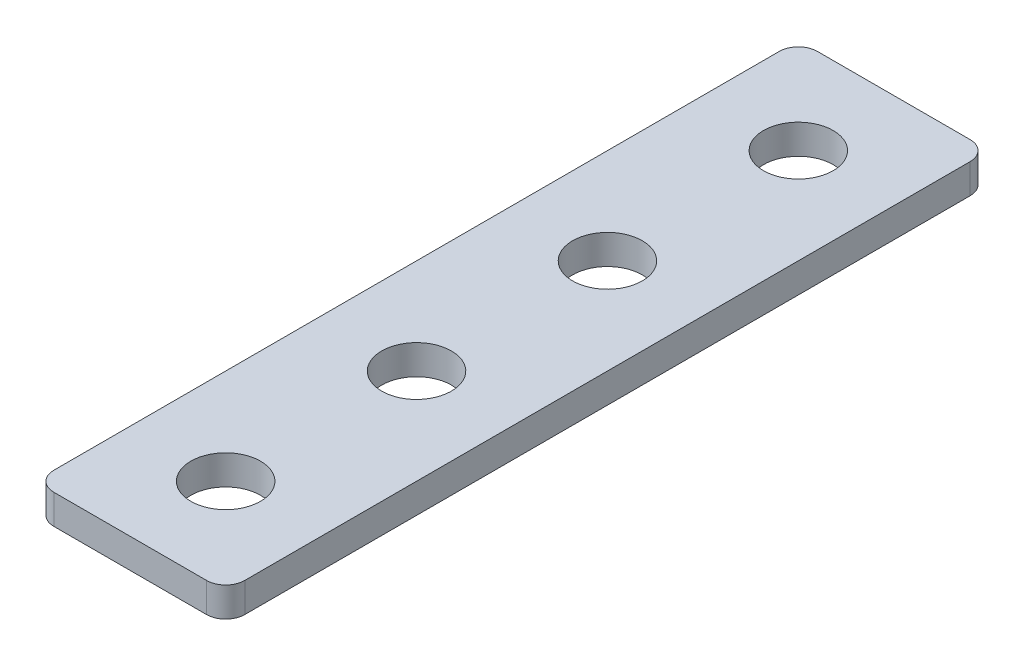
ISO-10303-21;
HEADER;
FILE_DESCRIPTION(('STEP AP214'),'2;1');
FILE_NAME('part.step','',(''),(''),'','','');
FILE_SCHEMA(('AUTOMOTIVE_DESIGN { 1 0 10303 214 1 1 1 1 }'));
ENDSEC;
DATA;
#1=APPLICATION_CONTEXT('core data for automotive mechanical design processes');
#2=APPLICATION_PROTOCOL_DEFINITION('international standard','automotive_design',2000,#1);
#3=PRODUCT_CONTEXT('',#1,'mechanical');
#4=PRODUCT('Part','Part','',(#3));
#5=PRODUCT_RELATED_PRODUCT_CATEGORY('part','',(#4));
#6=PRODUCT_DEFINITION_FORMATION('','',#4);
#7=PRODUCT_DEFINITION_CONTEXT('part definition',#1,'design');
#8=PRODUCT_DEFINITION('design','',#6,#7);
#9=PRODUCT_DEFINITION_SHAPE('','',#8);
#10=(LENGTH_UNIT() NAMED_UNIT(*) SI_UNIT(.MILLI.,.METRE.));
#11=(NAMED_UNIT(*) PLANE_ANGLE_UNIT() SI_UNIT($,.RADIAN.));
#12=(NAMED_UNIT(*) SI_UNIT($,.STERADIAN.) SOLID_ANGLE_UNIT());
#13=UNCERTAINTY_MEASURE_WITH_UNIT(LENGTH_MEASURE(1.E-05),#10,'distance_accuracy_value','');
#14=(GEOMETRIC_REPRESENTATION_CONTEXT(3) GLOBAL_UNCERTAINTY_ASSIGNED_CONTEXT((#13)) GLOBAL_UNIT_ASSIGNED_CONTEXT((#10,
#11,#12)) REPRESENTATION_CONTEXT('',''));
#15=CARTESIAN_POINT('',(0.,0.,0.));
#16=DIRECTION('',(0.,0.,1.));
#17=DIRECTION('',(1.,0.,0.));
#18=AXIS2_PLACEMENT_3D('',#15,#16,#17);
#19=CARTESIAN_POINT('',(0.,1.55,0.));
#20=DIRECTION('',(0.,1.,0.));
#21=DIRECTION('',(0.,0.,1.));
#22=AXIS2_PLACEMENT_3D('',#19,#20,#21);
#23=PLANE('',#22);
#24=CARTESIAN_POINT('',(0.,1.55,5.));
#25=DIRECTION('',(0.,1.,0.));
#26=DIRECTION('',(0.,0.,1.));
#27=AXIS2_PLACEMENT_3D('',#24,#25,#26);
#28=CIRCLE('',#27,1.825);
#29=CARTESIAN_POINT('',(0.,1.55,3.175));
#30=VERTEX_POINT('',#29);
#31=EDGE_CURVE('E195',#30,#30,#28,.T.);
#32=ORIENTED_EDGE('',*,*,#31,.F.);
#33=EDGE_LOOP('',(#32));
#34=FACE_BOUND('',#33,.T.);
#35=CARTESIAN_POINT('',(0.,1.55,-15.));
#36=DIRECTION('',(0.,1.,0.));
#37=DIRECTION('',(0.,0.,1.));
#38=AXIS2_PLACEMENT_3D('',#35,#36,#37);
#39=CIRCLE('',#38,1.825);
#40=CARTESIAN_POINT('',(0.,1.55,-16.825));
#41=VERTEX_POINT('',#40);
#42=EDGE_CURVE('E133',#41,#41,#39,.T.);
#43=ORIENTED_EDGE('',*,*,#42,.F.);
#44=EDGE_LOOP('',(#43));
#45=FACE_BOUND('',#44,.T.);
#46=DIRECTION('',(1.,0.,0.));
#47=VECTOR('',#46,1.);
#48=CARTESIAN_POINT('',(-5.,1.55,20.));
#49=LINE('',#48,#47);
#50=CARTESIAN_POINT('',(-4.,1.55,20.));
#51=VERTEX_POINT('',#50);
#52=CARTESIAN_POINT('',(4.,1.55,20.));
#53=VERTEX_POINT('',#52);
#54=EDGE_CURVE('E142',#51,#53,#49,.T.);
#55=ORIENTED_EDGE('',*,*,#54,.T.);
#56=CARTESIAN_POINT('',(4.,1.55,19.));
#57=DIRECTION('',(0.,1.,0.));
#58=DIRECTION('',(0.,0.,1.));
#59=AXIS2_PLACEMENT_3D('',#56,#57,#58);
#60=CIRCLE('',#59,1.);
#61=CARTESIAN_POINT('',(5.,1.55,19.));
#62=VERTEX_POINT('',#61);
#63=EDGE_CURVE('E160',#53,#62,#60,.T.);
#64=ORIENTED_EDGE('',*,*,#63,.T.);
#65=DIRECTION('',(0.,0.,-1.));
#66=VECTOR('',#65,1.);
#67=CARTESIAN_POINT('',(5.,1.55,-20.));
#68=LINE('',#67,#66);
#69=CARTESIAN_POINT('',(5.,1.55,-19.));
#70=VERTEX_POINT('',#69);
#71=EDGE_CURVE('E124',#62,#70,#68,.T.);
#72=ORIENTED_EDGE('',*,*,#71,.T.);
#73=CARTESIAN_POINT('',(4.,1.55,-19.));
#74=DIRECTION('',(0.,1.,0.));
#75=DIRECTION('',(0.,0.,1.));
#76=AXIS2_PLACEMENT_3D('',#73,#74,#75);
#77=CIRCLE('',#76,1.);
#78=CARTESIAN_POINT('',(4.,1.55,-20.));
#79=VERTEX_POINT('',#78);
#80=EDGE_CURVE('E156',#70,#79,#77,.T.);
#81=ORIENTED_EDGE('',*,*,#80,.T.);
#82=DIRECTION('',(-1.,0.,0.));
#83=VECTOR('',#82,1.);
#84=CARTESIAN_POINT('',(-5.,1.55,-20.));
#85=LINE('',#84,#83);
#86=CARTESIAN_POINT('',(-4.,1.55,-20.));
#87=VERTEX_POINT('',#86);
#88=EDGE_CURVE('E169',#79,#87,#85,.T.);
#89=ORIENTED_EDGE('',*,*,#88,.T.);
#90=CARTESIAN_POINT('',(-4.,1.55,-19.));
#91=DIRECTION('',(0.,1.,0.));
#92=DIRECTION('',(0.,0.,1.));
#93=AXIS2_PLACEMENT_3D('',#90,#91,#92);
#94=CIRCLE('',#93,1.);
#95=CARTESIAN_POINT('',(-5.,1.55,-19.));
#96=VERTEX_POINT('',#95);
#97=EDGE_CURVE('E59',#87,#96,#94,.T.);
#98=ORIENTED_EDGE('',*,*,#97,.T.);
#99=DIRECTION('',(0.,0.,1.));
#100=VECTOR('',#99,1.);
#101=CARTESIAN_POINT('',(-5.,1.55,-20.));
#102=LINE('',#101,#100);
#103=CARTESIAN_POINT('',(-5.,1.55,19.));
#104=VERTEX_POINT('',#103);
#105=EDGE_CURVE('E175',#96,#104,#102,.T.);
#106=ORIENTED_EDGE('',*,*,#105,.T.);
#107=CARTESIAN_POINT('',(-4.,1.55,19.));
#108=DIRECTION('',(0.,1.,0.));
#109=DIRECTION('',(0.,0.,1.));
#110=AXIS2_PLACEMENT_3D('',#107,#108,#109);
#111=CIRCLE('',#110,1.);
#112=EDGE_CURVE('E158',#104,#51,#111,.T.);
#113=ORIENTED_EDGE('',*,*,#112,.T.);
#114=EDGE_LOOP('',(#55,#64,#72,#81,#89,#98,#106,#113));
#115=FACE_BOUND('',#114,.T.);
#116=CARTESIAN_POINT('',(0.,1.55,-5.));
#117=DIRECTION('',(0.,1.,0.));
#118=DIRECTION('',(0.,0.,1.));
#119=AXIS2_PLACEMENT_3D('',#116,#117,#118);
#120=CIRCLE('',#119,1.825);
#121=CARTESIAN_POINT('',(0.,1.55,-6.825));
#122=VERTEX_POINT('',#121);
#123=EDGE_CURVE('E190',#122,#122,#120,.T.);
#124=ORIENTED_EDGE('',*,*,#123,.F.);
#125=EDGE_LOOP('',(#124));
#126=FACE_BOUND('',#125,.T.);
#127=CARTESIAN_POINT('',(0.,1.55,15.));
#128=DIRECTION('',(0.,1.,0.));
#129=DIRECTION('',(0.,0.,1.));
#130=AXIS2_PLACEMENT_3D('',#127,#128,#129);
#131=CIRCLE('',#130,1.825);
#132=CARTESIAN_POINT('',(0.,1.55,13.175));
#133=VERTEX_POINT('',#132);
#134=EDGE_CURVE('E201',#133,#133,#131,.T.);
#135=ORIENTED_EDGE('',*,*,#134,.F.);
#136=EDGE_LOOP('',(#135));
#137=FACE_BOUND('',#136,.T.);
#138=ADVANCED_FACE('F37',(#34,#45,#115,#126,#137),#23,.T.);
#139=CARTESIAN_POINT('',(0.,0.,0.));
#140=DIRECTION('',(0.,1.,0.));
#141=DIRECTION('',(0.,0.,1.));
#142=AXIS2_PLACEMENT_3D('',#139,#140,#141);
#143=PLANE('',#142);
#144=DIRECTION('',(0.,0.,-1.));
#145=VECTOR('',#144,1.);
#146=CARTESIAN_POINT('',(5.,0.,-20.));
#147=LINE('',#146,#145);
#148=CARTESIAN_POINT('',(5.,0.,19.));
#149=VERTEX_POINT('',#148);
#150=CARTESIAN_POINT('',(5.,0.,-19.));
#151=VERTEX_POINT('',#150);
#152=EDGE_CURVE('E121',#149,#151,#147,.T.);
#153=ORIENTED_EDGE('',*,*,#152,.F.);
#154=CARTESIAN_POINT('',(4.,0.,19.));
#155=DIRECTION('',(0.,1.,0.));
#156=DIRECTION('',(0.,0.,1.));
#157=AXIS2_PLACEMENT_3D('',#154,#155,#156);
#158=CIRCLE('',#157,1.);
#159=CARTESIAN_POINT('',(4.,0.,20.));
#160=VERTEX_POINT('',#159);
#161=EDGE_CURVE('E104',#149,#160,#158,.F.);
#162=ORIENTED_EDGE('',*,*,#161,.T.);
#163=DIRECTION('',(1.,0.,0.));
#164=VECTOR('',#163,1.);
#165=CARTESIAN_POINT('',(-5.,0.,20.));
#166=LINE('',#165,#164);
#167=CARTESIAN_POINT('',(-4.,0.,20.));
#168=VERTEX_POINT('',#167);
#169=EDGE_CURVE('E146',#168,#160,#166,.T.);
#170=ORIENTED_EDGE('',*,*,#169,.F.);
#171=CARTESIAN_POINT('',(-4.,0.,19.));
#172=DIRECTION('',(0.,1.,0.));
#173=DIRECTION('',(0.,0.,1.));
#174=AXIS2_PLACEMENT_3D('',#171,#172,#173);
#175=CIRCLE('',#174,1.);
#176=CARTESIAN_POINT('',(-5.,0.,19.));
#177=VERTEX_POINT('',#176);
#178=EDGE_CURVE('E115',#168,#177,#175,.F.);
#179=ORIENTED_EDGE('',*,*,#178,.T.);
#180=DIRECTION('',(0.,0.,1.));
#181=VECTOR('',#180,1.);
#182=CARTESIAN_POINT('',(-5.,0.,-20.));
#183=LINE('',#182,#181);
#184=CARTESIAN_POINT('',(-5.,0.,-19.));
#185=VERTEX_POINT('',#184);
#186=EDGE_CURVE('E136',#185,#177,#183,.T.);
#187=ORIENTED_EDGE('',*,*,#186,.F.);
#188=CARTESIAN_POINT('',(-4.,0.,-19.));
#189=DIRECTION('',(0.,1.,0.));
#190=DIRECTION('',(0.,0.,1.));
#191=AXIS2_PLACEMENT_3D('',#188,#189,#190);
#192=CIRCLE('',#191,1.);
#193=CARTESIAN_POINT('',(-4.,0.,-20.));
#194=VERTEX_POINT('',#193);
#195=EDGE_CURVE('E125',#185,#194,#192,.F.);
#196=ORIENTED_EDGE('',*,*,#195,.T.);
#197=DIRECTION('',(-1.,0.,0.));
#198=VECTOR('',#197,1.);
#199=CARTESIAN_POINT('',(-5.,0.,-20.));
#200=LINE('',#199,#198);
#201=CARTESIAN_POINT('',(4.,0.,-20.));
#202=VERTEX_POINT('',#201);
#203=EDGE_CURVE('E132',#202,#194,#200,.T.);
#204=ORIENTED_EDGE('',*,*,#203,.F.);
#205=CARTESIAN_POINT('',(4.,0.,-19.));
#206=DIRECTION('',(0.,1.,0.));
#207=DIRECTION('',(0.,0.,1.));
#208=AXIS2_PLACEMENT_3D('',#205,#206,#207);
#209=CIRCLE('',#208,1.);
#210=EDGE_CURVE('E131',#202,#151,#209,.F.);
#211=ORIENTED_EDGE('',*,*,#210,.T.);
#212=EDGE_LOOP('',(#153,#162,#170,#179,#187,#196,#204,#211));
#213=FACE_BOUND('',#212,.T.);
#214=CARTESIAN_POINT('',(0.,0.,-15.));
#215=DIRECTION('',(0.,1.,0.));
#216=DIRECTION('',(0.,0.,1.));
#217=AXIS2_PLACEMENT_3D('',#214,#215,#216);
#218=CIRCLE('',#217,1.825);
#219=CARTESIAN_POINT('',(0.,0.,-16.825));
#220=VERTEX_POINT('',#219);
#221=EDGE_CURVE('E139',#220,#220,#218,.T.);
#222=ORIENTED_EDGE('',*,*,#221,.T.);
#223=EDGE_LOOP('',(#222));
#224=FACE_BOUND('',#223,.T.);
#225=CARTESIAN_POINT('',(0.,0.,-5.));
#226=DIRECTION('',(0.,1.,0.));
#227=DIRECTION('',(0.,0.,1.));
#228=AXIS2_PLACEMENT_3D('',#225,#226,#227);
#229=CIRCLE('',#228,1.825);
#230=CARTESIAN_POINT('',(0.,0.,-6.825));
#231=VERTEX_POINT('',#230);
#232=EDGE_CURVE('E192',#231,#231,#229,.T.);
#233=ORIENTED_EDGE('',*,*,#232,.T.);
#234=EDGE_LOOP('',(#233));
#235=FACE_BOUND('',#234,.T.);
#236=CARTESIAN_POINT('',(0.,0.,5.));
#237=DIRECTION('',(0.,1.,0.));
#238=DIRECTION('',(0.,0.,1.));
#239=AXIS2_PLACEMENT_3D('',#236,#237,#238);
#240=CIRCLE('',#239,1.825);
#241=CARTESIAN_POINT('',(0.,0.,3.175));
#242=VERTEX_POINT('',#241);
#243=EDGE_CURVE('E198',#242,#242,#240,.T.);
#244=ORIENTED_EDGE('',*,*,#243,.T.);
#245=EDGE_LOOP('',(#244));
#246=FACE_BOUND('',#245,.T.);
#247=CARTESIAN_POINT('',(0.,0.,15.));
#248=DIRECTION('',(0.,1.,0.));
#249=DIRECTION('',(0.,0.,1.));
#250=AXIS2_PLACEMENT_3D('',#247,#248,#249);
#251=CIRCLE('',#250,1.825);
#252=CARTESIAN_POINT('',(0.,0.,13.175));
#253=VERTEX_POINT('',#252);
#254=EDGE_CURVE('E204',#253,#253,#251,.T.);
#255=ORIENTED_EDGE('',*,*,#254,.T.);
#256=EDGE_LOOP('',(#255));
#257=FACE_BOUND('',#256,.T.);
#258=ADVANCED_FACE('F128',(#213,#224,#235,#246,#257),#143,.F.);
#259=CARTESIAN_POINT('',(5.,1.55,-20.));
#260=DIRECTION('',(-1.,0.,0.));
#261=DIRECTION('',(0.,0.,1.));
#262=AXIS2_PLACEMENT_3D('',#259,#260,#261);
#263=PLANE('',#262);
#264=ORIENTED_EDGE('',*,*,#71,.F.);
#265=DIRECTION('',(0.,-1.,0.));
#266=VECTOR('',#265,1.);
#267=CARTESIAN_POINT('',(5.,1.55,19.));
#268=LINE('',#267,#266);
#269=EDGE_CURVE('E108',#62,#149,#268,.T.);
#270=ORIENTED_EDGE('',*,*,#269,.T.);
#271=ORIENTED_EDGE('',*,*,#152,.T.);
#272=DIRECTION('',(0.,-1.,0.));
#273=VECTOR('',#272,1.);
#274=CARTESIAN_POINT('',(5.,1.55,-19.));
#275=LINE('',#274,#273);
#276=EDGE_CURVE('E126',#151,#70,#275,.F.);
#277=ORIENTED_EDGE('',*,*,#276,.T.);
#278=EDGE_LOOP('',(#264,#270,#271,#277));
#279=FACE_BOUND('',#278,.T.);
#280=ADVANCED_FACE('F120',(#279),#263,.F.);
#281=CARTESIAN_POINT('',(-5.,1.55,-20.));
#282=DIRECTION('',(0.,0.,1.));
#283=DIRECTION('',(1.,0.,0.));
#284=AXIS2_PLACEMENT_3D('',#281,#282,#283);
#285=PLANE('',#284);
#286=ORIENTED_EDGE('',*,*,#88,.F.);
#287=DIRECTION('',(0.,-1.,0.));
#288=VECTOR('',#287,1.);
#289=CARTESIAN_POINT('',(4.,1.55,-20.));
#290=LINE('',#289,#288);
#291=EDGE_CURVE('E11',#79,#202,#290,.T.);
#292=ORIENTED_EDGE('',*,*,#291,.T.);
#293=ORIENTED_EDGE('',*,*,#203,.T.);
#294=DIRECTION('',(0.,-1.,0.));
#295=VECTOR('',#294,1.);
#296=CARTESIAN_POINT('',(-4.,1.55,-20.));
#297=LINE('',#296,#295);
#298=EDGE_CURVE('E45',#194,#87,#297,.F.);
#299=ORIENTED_EDGE('',*,*,#298,.T.);
#300=EDGE_LOOP('',(#286,#292,#293,#299));
#301=FACE_BOUND('',#300,.T.);
#302=ADVANCED_FACE('F168',(#301),#285,.F.);
#303=CARTESIAN_POINT('',(-5.,1.55,-20.));
#304=DIRECTION('',(1.,0.,0.));
#305=DIRECTION('',(0.,0.,-1.));
#306=AXIS2_PLACEMENT_3D('',#303,#304,#305);
#307=PLANE('',#306);
#308=ORIENTED_EDGE('',*,*,#186,.T.);
#309=DIRECTION('',(0.,-1.,0.));
#310=VECTOR('',#309,1.);
#311=CARTESIAN_POINT('',(-5.,1.55,19.));
#312=LINE('',#311,#310);
#313=EDGE_CURVE('E52',#177,#104,#312,.F.);
#314=ORIENTED_EDGE('',*,*,#313,.T.);
#315=ORIENTED_EDGE('',*,*,#105,.F.);
#316=DIRECTION('',(0.,-1.,0.));
#317=VECTOR('',#316,1.);
#318=CARTESIAN_POINT('',(-5.,1.55,-19.));
#319=LINE('',#318,#317);
#320=EDGE_CURVE('E162',#96,#185,#319,.T.);
#321=ORIENTED_EDGE('',*,*,#320,.T.);
#322=EDGE_LOOP('',(#308,#314,#315,#321));
#323=FACE_BOUND('',#322,.T.);
#324=ADVANCED_FACE('F179',(#323),#307,.F.);
#325=CARTESIAN_POINT('',(-5.,1.55,20.));
#326=DIRECTION('',(0.,0.,-1.));
#327=DIRECTION('',(-1.,0.,0.));
#328=AXIS2_PLACEMENT_3D('',#325,#326,#327);
#329=PLANE('',#328);
#330=ORIENTED_EDGE('',*,*,#169,.T.);
#331=DIRECTION('',(0.,-1.,0.));
#332=VECTOR('',#331,1.);
#333=CARTESIAN_POINT('',(4.,1.55,20.));
#334=LINE('',#333,#332);
#335=EDGE_CURVE('E109',#160,#53,#334,.F.);
#336=ORIENTED_EDGE('',*,*,#335,.T.);
#337=ORIENTED_EDGE('',*,*,#54,.F.);
#338=DIRECTION('',(0.,-1.,0.));
#339=VECTOR('',#338,1.);
#340=CARTESIAN_POINT('',(-4.,1.55,20.));
#341=LINE('',#340,#339);
#342=EDGE_CURVE('E114',#51,#168,#341,.T.);
#343=ORIENTED_EDGE('',*,*,#342,.T.);
#344=EDGE_LOOP('',(#330,#336,#337,#343));
#345=FACE_BOUND('',#344,.T.);
#346=ADVANCED_FACE('F186',(#345),#329,.F.);
#347=CARTESIAN_POINT('',(0.,1.55,-15.));
#348=DIRECTION('',(0.,-1.,0.));
#349=DIRECTION('',(0.,0.,-1.));
#350=AXIS2_PLACEMENT_3D('',#347,#348,#349);
#351=CYLINDRICAL_SURFACE('',#350,1.825);
#352=CARTESIAN_POINT('',(0.,1.55,-16.825));
#353=CARTESIAN_POINT('',(0.,1.53385416666667,-16.825));
#354=CARTESIAN_POINT('',(0.,1.51770833333333,-16.825));
#355=CARTESIAN_POINT('',(0.,1.48541666666667,-16.825));
#356=CARTESIAN_POINT('',(0.,1.46927083333333,-16.825));
#357=CARTESIAN_POINT('',(0.,1.43697916666667,-16.825));
#358=CARTESIAN_POINT('',(0.,1.42083333333333,-16.825));
#359=CARTESIAN_POINT('',(0.,1.38854166666667,-16.825));
#360=CARTESIAN_POINT('',(0.,1.37239583333333,-16.825));
#361=CARTESIAN_POINT('',(0.,1.34010416666667,-16.825));
#362=CARTESIAN_POINT('',(0.,1.32395833333333,-16.825));
#363=CARTESIAN_POINT('',(0.,1.29166666666667,-16.825));
#364=CARTESIAN_POINT('',(0.,1.27552083333333,-16.825));
#365=CARTESIAN_POINT('',(0.,1.24322916666667,-16.825));
#366=CARTESIAN_POINT('',(0.,1.22708333333333,-16.825));
#367=CARTESIAN_POINT('',(0.,1.19479166666667,-16.825));
#368=CARTESIAN_POINT('',(0.,1.17864583333333,-16.825));
#369=CARTESIAN_POINT('',(0.,1.14635416666667,-16.825));
#370=CARTESIAN_POINT('',(0.,1.13020833333333,-16.825));
#371=CARTESIAN_POINT('',(0.,1.09791666666667,-16.825));
#372=CARTESIAN_POINT('',(0.,1.08177083333333,-16.825));
#373=CARTESIAN_POINT('',(0.,1.04947916666667,-16.825));
#374=CARTESIAN_POINT('',(0.,1.03333333333333,-16.825));
#375=CARTESIAN_POINT('',(0.,1.00104166666667,-16.825));
#376=CARTESIAN_POINT('',(0.,0.984895833333333,-16.825));
#377=CARTESIAN_POINT('',(0.,0.952604166666667,-16.825));
#378=CARTESIAN_POINT('',(0.,0.936458333333333,-16.825));
#379=CARTESIAN_POINT('',(0.,0.904166666666667,-16.825));
#380=CARTESIAN_POINT('',(0.,0.888020833333333,-16.825));
#381=CARTESIAN_POINT('',(0.,0.855729166666667,-16.825));
#382=CARTESIAN_POINT('',(0.,0.839583333333333,-16.825));
#383=CARTESIAN_POINT('',(0.,0.807291666666667,-16.825));
#384=CARTESIAN_POINT('',(0.,0.791145833333333,-16.825));
#385=CARTESIAN_POINT('',(0.,0.758854166666667,-16.825));
#386=CARTESIAN_POINT('',(0.,0.742708333333333,-16.825));
#387=CARTESIAN_POINT('',(0.,0.710416666666667,-16.825));
#388=CARTESIAN_POINT('',(0.,0.694270833333333,-16.825));
#389=CARTESIAN_POINT('',(0.,0.661979166666667,-16.825));
#390=CARTESIAN_POINT('',(0.,0.645833333333333,-16.825));
#391=CARTESIAN_POINT('',(0.,0.613541666666667,-16.825));
#392=CARTESIAN_POINT('',(0.,0.597395833333333,-16.825));
#393=CARTESIAN_POINT('',(0.,0.565104166666667,-16.825));
#394=CARTESIAN_POINT('',(0.,0.548958333333333,-16.825));
#395=CARTESIAN_POINT('',(0.,0.516666666666667,-16.825));
#396=CARTESIAN_POINT('',(0.,0.500520833333333,-16.825));
#397=CARTESIAN_POINT('',(0.,0.468229166666667,-16.825));
#398=CARTESIAN_POINT('',(0.,0.452083333333333,-16.825));
#399=CARTESIAN_POINT('',(0.,0.419791666666667,-16.825));
#400=CARTESIAN_POINT('',(0.,0.403645833333333,-16.825));
#401=CARTESIAN_POINT('',(0.,0.371354166666667,-16.825));
#402=CARTESIAN_POINT('',(0.,0.355208333333333,-16.825));
#403=CARTESIAN_POINT('',(0.,0.322916666666667,-16.825));
#404=CARTESIAN_POINT('',(0.,0.306770833333333,-16.825));
#405=CARTESIAN_POINT('',(0.,0.274479166666667,-16.825));
#406=CARTESIAN_POINT('',(0.,0.258333333333333,-16.825));
#407=CARTESIAN_POINT('',(0.,0.226041666666667,-16.825));
#408=CARTESIAN_POINT('',(0.,0.209895833333333,-16.825));
#409=CARTESIAN_POINT('',(0.,0.177604166666667,-16.825));
#410=CARTESIAN_POINT('',(0.,0.161458333333333,-16.825));
#411=CARTESIAN_POINT('',(0.,0.129166666666667,-16.825));
#412=CARTESIAN_POINT('',(0.,0.113020833333333,-16.825));
#413=CARTESIAN_POINT('',(0.,0.0807291666666667,-16.825));
#414=CARTESIAN_POINT('',(0.,0.0645833333333334,-16.825));
#415=CARTESIAN_POINT('',(0.,0.0322916666666667,-16.825));
#416=CARTESIAN_POINT('',(0.,0.0161458333333334,-16.825));
#417=CARTESIAN_POINT('',(0.,0.,-16.825));
#418=B_SPLINE_CURVE_WITH_KNOTS('',3,(#352,#353,#354,#355,#356,#357,#358,#359,#360,#361,#362,
#363,#364,#365,#366,#367,#368,#369,#370,#371,#372,#373,#374,#375,#376,#377,#378,#379,#380,#381,
#382,#383,#384,#385,#386,#387,#388,#389,#390,#391,#392,#393,#394,#395,#396,#397,#398,#399,#400,
#401,#402,#403,#404,#405,#406,#407,#408,#409,#410,#411,#412,#413,#414,#415,#416,#417),
.UNSPECIFIED.,.F.,.F.,(4,2,2,2,2,2,2,2,2,2,2,2,2,2,2,2,2,2,2,2,2,2,2,2,2,2,2,2,2,2,2,2,4),(0.,
0.0484374999999999,0.096875,0.1453125,0.19375,0.2421875,0.290625,0.3390625,0.3875,0.4359375,
0.484375,0.5328125,0.58125,0.6296875,0.678125,0.7265625,0.775,0.8234375,0.871875,0.9203125,
0.96875,1.0171875,1.065625,1.1140625,1.1625,1.2109375,1.259375,1.3078125,1.35625,1.4046875,
1.453125,1.5015625,1.55),.UNSPECIFIED.);
#419=EDGE_CURVE('BSEAM223',#41,#220,#418,.T.);
#420=ORIENTED_EDGE('',*,*,#42,.T.);
#421=ORIENTED_EDGE('',*,*,#221,.F.);
#422=ORIENTED_EDGE('',*,*,#419,.T.);
#423=ORIENTED_EDGE('',*,*,#419,.F.);
#424=EDGE_LOOP('',(#420,#422,#421,#423));
#425=FACE_BOUND('',#424,.T.);
#426=ADVANCED_FACE('F223',(#425),#351,.F.);
#427=CARTESIAN_POINT('',(0.,1.55,-5.));
#428=DIRECTION('',(0.,-1.,0.));
#429=DIRECTION('',(0.,0.,-1.));
#430=AXIS2_PLACEMENT_3D('',#427,#428,#429);
#431=CYLINDRICAL_SURFACE('',#430,1.825);
#432=CARTESIAN_POINT('',(0.,1.55,-6.825));
#433=CARTESIAN_POINT('',(0.,1.53385416666667,-6.825));
#434=CARTESIAN_POINT('',(0.,1.51770833333333,-6.825));
#435=CARTESIAN_POINT('',(0.,1.48541666666667,-6.825));
#436=CARTESIAN_POINT('',(0.,1.46927083333333,-6.825));
#437=CARTESIAN_POINT('',(0.,1.43697916666667,-6.825));
#438=CARTESIAN_POINT('',(0.,1.42083333333333,-6.825));
#439=CARTESIAN_POINT('',(0.,1.38854166666667,-6.825));
#440=CARTESIAN_POINT('',(0.,1.37239583333333,-6.825));
#441=CARTESIAN_POINT('',(0.,1.34010416666667,-6.825));
#442=CARTESIAN_POINT('',(0.,1.32395833333333,-6.825));
#443=CARTESIAN_POINT('',(0.,1.29166666666667,-6.825));
#444=CARTESIAN_POINT('',(0.,1.27552083333333,-6.825));
#445=CARTESIAN_POINT('',(0.,1.24322916666667,-6.825));
#446=CARTESIAN_POINT('',(0.,1.22708333333333,-6.825));
#447=CARTESIAN_POINT('',(0.,1.19479166666667,-6.825));
#448=CARTESIAN_POINT('',(0.,1.17864583333333,-6.825));
#449=CARTESIAN_POINT('',(0.,1.14635416666667,-6.825));
#450=CARTESIAN_POINT('',(0.,1.13020833333333,-6.825));
#451=CARTESIAN_POINT('',(0.,1.09791666666667,-6.825));
#452=CARTESIAN_POINT('',(0.,1.08177083333333,-6.825));
#453=CARTESIAN_POINT('',(0.,1.04947916666667,-6.825));
#454=CARTESIAN_POINT('',(0.,1.03333333333333,-6.825));
#455=CARTESIAN_POINT('',(0.,1.00104166666667,-6.825));
#456=CARTESIAN_POINT('',(0.,0.984895833333333,-6.825));
#457=CARTESIAN_POINT('',(0.,0.952604166666667,-6.825));
#458=CARTESIAN_POINT('',(0.,0.936458333333333,-6.825));
#459=CARTESIAN_POINT('',(0.,0.904166666666667,-6.825));
#460=CARTESIAN_POINT('',(0.,0.888020833333333,-6.825));
#461=CARTESIAN_POINT('',(0.,0.855729166666667,-6.825));
#462=CARTESIAN_POINT('',(0.,0.839583333333333,-6.825));
#463=CARTESIAN_POINT('',(0.,0.807291666666667,-6.825));
#464=CARTESIAN_POINT('',(0.,0.791145833333333,-6.825));
#465=CARTESIAN_POINT('',(0.,0.758854166666667,-6.825));
#466=CARTESIAN_POINT('',(0.,0.742708333333333,-6.825));
#467=CARTESIAN_POINT('',(0.,0.710416666666667,-6.825));
#468=CARTESIAN_POINT('',(0.,0.694270833333333,-6.825));
#469=CARTESIAN_POINT('',(0.,0.661979166666667,-6.825));
#470=CARTESIAN_POINT('',(0.,0.645833333333333,-6.825));
#471=CARTESIAN_POINT('',(0.,0.613541666666667,-6.825));
#472=CARTESIAN_POINT('',(0.,0.597395833333333,-6.825));
#473=CARTESIAN_POINT('',(0.,0.565104166666667,-6.825));
#474=CARTESIAN_POINT('',(0.,0.548958333333333,-6.825));
#475=CARTESIAN_POINT('',(0.,0.516666666666667,-6.825));
#476=CARTESIAN_POINT('',(0.,0.500520833333333,-6.825));
#477=CARTESIAN_POINT('',(0.,0.468229166666667,-6.825));
#478=CARTESIAN_POINT('',(0.,0.452083333333333,-6.825));
#479=CARTESIAN_POINT('',(0.,0.419791666666667,-6.825));
#480=CARTESIAN_POINT('',(0.,0.403645833333333,-6.825));
#481=CARTESIAN_POINT('',(0.,0.371354166666667,-6.825));
#482=CARTESIAN_POINT('',(0.,0.355208333333333,-6.825));
#483=CARTESIAN_POINT('',(0.,0.322916666666667,-6.825));
#484=CARTESIAN_POINT('',(0.,0.306770833333333,-6.825));
#485=CARTESIAN_POINT('',(0.,0.274479166666667,-6.825));
#486=CARTESIAN_POINT('',(0.,0.258333333333333,-6.825));
#487=CARTESIAN_POINT('',(0.,0.226041666666667,-6.825));
#488=CARTESIAN_POINT('',(0.,0.209895833333333,-6.825));
#489=CARTESIAN_POINT('',(0.,0.177604166666667,-6.825));
#490=CARTESIAN_POINT('',(0.,0.161458333333333,-6.825));
#491=CARTESIAN_POINT('',(0.,0.129166666666667,-6.825));
#492=CARTESIAN_POINT('',(0.,0.113020833333333,-6.825));
#493=CARTESIAN_POINT('',(0.,0.0807291666666667,-6.825));
#494=CARTESIAN_POINT('',(0.,0.0645833333333334,-6.825));
#495=CARTESIAN_POINT('',(0.,0.0322916666666667,-6.825));
#496=CARTESIAN_POINT('',(0.,0.0161458333333334,-6.825));
#497=CARTESIAN_POINT('',(0.,0.,-6.825));
#498=B_SPLINE_CURVE_WITH_KNOTS('',3,(#432,#433,#434,#435,#436,#437,#438,#439,#440,#441,#442,
#443,#444,#445,#446,#447,#448,#449,#450,#451,#452,#453,#454,#455,#456,#457,#458,#459,#460,#461,
#462,#463,#464,#465,#466,#467,#468,#469,#470,#471,#472,#473,#474,#475,#476,#477,#478,#479,#480,
#481,#482,#483,#484,#485,#486,#487,#488,#489,#490,#491,#492,#493,#494,#495,#496,#497),
.UNSPECIFIED.,.F.,.F.,(4,2,2,2,2,2,2,2,2,2,2,2,2,2,2,2,2,2,2,2,2,2,2,2,2,2,2,2,2,2,2,2,4),(0.,
0.0484374999999999,0.096875,0.1453125,0.19375,0.2421875,0.290625,0.3390625,0.3875,0.4359375,
0.484375,0.5328125,0.58125,0.6296875,0.678125,0.7265625,0.775,0.8234375,0.871875,0.9203125,
0.96875,1.0171875,1.065625,1.1140625,1.1625,1.2109375,1.259375,1.3078125,1.35625,1.4046875,
1.453125,1.5015625,1.55),.UNSPECIFIED.);
#499=EDGE_CURVE('BSEAM326',#122,#231,#498,.T.);
#500=ORIENTED_EDGE('',*,*,#123,.T.);
#501=ORIENTED_EDGE('',*,*,#232,.F.);
#502=ORIENTED_EDGE('',*,*,#499,.T.);
#503=ORIENTED_EDGE('',*,*,#499,.F.);
#504=EDGE_LOOP('',(#500,#502,#501,#503));
#505=FACE_BOUND('',#504,.T.);
#506=ADVANCED_FACE('F326',(#505),#431,.F.);
#507=CARTESIAN_POINT('',(0.,1.55,5.));
#508=DIRECTION('',(0.,-1.,0.));
#509=DIRECTION('',(0.,0.,-1.));
#510=AXIS2_PLACEMENT_3D('',#507,#508,#509);
#511=CYLINDRICAL_SURFACE('',#510,1.825);
#512=CARTESIAN_POINT('',(0.,1.55,3.175));
#513=CARTESIAN_POINT('',(0.,1.53385416666667,3.175));
#514=CARTESIAN_POINT('',(0.,1.51770833333333,3.175));
#515=CARTESIAN_POINT('',(0.,1.48541666666667,3.175));
#516=CARTESIAN_POINT('',(0.,1.46927083333333,3.175));
#517=CARTESIAN_POINT('',(0.,1.43697916666667,3.175));
#518=CARTESIAN_POINT('',(0.,1.42083333333333,3.175));
#519=CARTESIAN_POINT('',(0.,1.38854166666667,3.175));
#520=CARTESIAN_POINT('',(0.,1.37239583333333,3.175));
#521=CARTESIAN_POINT('',(0.,1.34010416666667,3.175));
#522=CARTESIAN_POINT('',(0.,1.32395833333333,3.175));
#523=CARTESIAN_POINT('',(0.,1.29166666666667,3.175));
#524=CARTESIAN_POINT('',(0.,1.27552083333333,3.175));
#525=CARTESIAN_POINT('',(0.,1.24322916666667,3.175));
#526=CARTESIAN_POINT('',(0.,1.22708333333333,3.175));
#527=CARTESIAN_POINT('',(0.,1.19479166666667,3.175));
#528=CARTESIAN_POINT('',(0.,1.17864583333333,3.175));
#529=CARTESIAN_POINT('',(0.,1.14635416666667,3.175));
#530=CARTESIAN_POINT('',(0.,1.13020833333333,3.175));
#531=CARTESIAN_POINT('',(0.,1.09791666666667,3.175));
#532=CARTESIAN_POINT('',(0.,1.08177083333333,3.175));
#533=CARTESIAN_POINT('',(0.,1.04947916666667,3.175));
#534=CARTESIAN_POINT('',(0.,1.03333333333333,3.175));
#535=CARTESIAN_POINT('',(0.,1.00104166666667,3.175));
#536=CARTESIAN_POINT('',(0.,0.984895833333333,3.175));
#537=CARTESIAN_POINT('',(0.,0.952604166666667,3.175));
#538=CARTESIAN_POINT('',(0.,0.936458333333333,3.175));
#539=CARTESIAN_POINT('',(0.,0.904166666666667,3.175));
#540=CARTESIAN_POINT('',(0.,0.888020833333333,3.175));
#541=CARTESIAN_POINT('',(0.,0.855729166666667,3.175));
#542=CARTESIAN_POINT('',(0.,0.839583333333333,3.175));
#543=CARTESIAN_POINT('',(0.,0.807291666666667,3.175));
#544=CARTESIAN_POINT('',(0.,0.791145833333333,3.175));
#545=CARTESIAN_POINT('',(0.,0.758854166666667,3.175));
#546=CARTESIAN_POINT('',(0.,0.742708333333333,3.175));
#547=CARTESIAN_POINT('',(0.,0.710416666666667,3.175));
#548=CARTESIAN_POINT('',(0.,0.694270833333333,3.175));
#549=CARTESIAN_POINT('',(0.,0.661979166666667,3.175));
#550=CARTESIAN_POINT('',(0.,0.645833333333333,3.175));
#551=CARTESIAN_POINT('',(0.,0.613541666666667,3.175));
#552=CARTESIAN_POINT('',(0.,0.597395833333333,3.175));
#553=CARTESIAN_POINT('',(0.,0.565104166666667,3.175));
#554=CARTESIAN_POINT('',(0.,0.548958333333333,3.175));
#555=CARTESIAN_POINT('',(0.,0.516666666666667,3.175));
#556=CARTESIAN_POINT('',(0.,0.500520833333333,3.175));
#557=CARTESIAN_POINT('',(0.,0.468229166666667,3.175));
#558=CARTESIAN_POINT('',(0.,0.452083333333333,3.175));
#559=CARTESIAN_POINT('',(0.,0.419791666666667,3.175));
#560=CARTESIAN_POINT('',(0.,0.403645833333333,3.175));
#561=CARTESIAN_POINT('',(0.,0.371354166666667,3.175));
#562=CARTESIAN_POINT('',(0.,0.355208333333333,3.175));
#563=CARTESIAN_POINT('',(0.,0.322916666666667,3.175));
#564=CARTESIAN_POINT('',(0.,0.306770833333333,3.175));
#565=CARTESIAN_POINT('',(0.,0.274479166666667,3.175));
#566=CARTESIAN_POINT('',(0.,0.258333333333333,3.175));
#567=CARTESIAN_POINT('',(0.,0.226041666666667,3.175));
#568=CARTESIAN_POINT('',(0.,0.209895833333333,3.175));
#569=CARTESIAN_POINT('',(0.,0.177604166666667,3.175));
#570=CARTESIAN_POINT('',(0.,0.161458333333333,3.175));
#571=CARTESIAN_POINT('',(0.,0.129166666666667,3.175));
#572=CARTESIAN_POINT('',(0.,0.113020833333333,3.175));
#573=CARTESIAN_POINT('',(0.,0.0807291666666667,3.175));
#574=CARTESIAN_POINT('',(0.,0.0645833333333334,3.175));
#575=CARTESIAN_POINT('',(0.,0.0322916666666667,3.175));
#576=CARTESIAN_POINT('',(0.,0.0161458333333334,3.175));
#577=CARTESIAN_POINT('',(0.,0.,3.175));
#578=B_SPLINE_CURVE_WITH_KNOTS('',3,(#512,#513,#514,#515,#516,#517,#518,#519,#520,#521,#522,
#523,#524,#525,#526,#527,#528,#529,#530,#531,#532,#533,#534,#535,#536,#537,#538,#539,#540,#541,
#542,#543,#544,#545,#546,#547,#548,#549,#550,#551,#552,#553,#554,#555,#556,#557,#558,#559,#560,
#561,#562,#563,#564,#565,#566,#567,#568,#569,#570,#571,#572,#573,#574,#575,#576,#577),
.UNSPECIFIED.,.F.,.F.,(4,2,2,2,2,2,2,2,2,2,2,2,2,2,2,2,2,2,2,2,2,2,2,2,2,2,2,2,2,2,2,2,4),(0.,
0.0484374999999999,0.096875,0.1453125,0.19375,0.2421875,0.290625,0.3390625,0.3875,0.4359375,
0.484375,0.5328125,0.58125,0.6296875,0.678125,0.7265625,0.775,0.8234375,0.871875,0.9203125,
0.96875,1.0171875,1.065625,1.1140625,1.1625,1.2109375,1.259375,1.3078125,1.35625,1.4046875,
1.453125,1.5015625,1.55),.UNSPECIFIED.);
#579=EDGE_CURVE('BSEAM316',#30,#242,#578,.T.);
#580=ORIENTED_EDGE('',*,*,#31,.T.);
#581=ORIENTED_EDGE('',*,*,#243,.F.);
#582=ORIENTED_EDGE('',*,*,#579,.T.);
#583=ORIENTED_EDGE('',*,*,#579,.F.);
#584=EDGE_LOOP('',(#580,#582,#581,#583));
#585=FACE_BOUND('',#584,.T.);
#586=ADVANCED_FACE('F316',(#585),#511,.F.);
#587=CARTESIAN_POINT('',(0.,1.55,15.));
#588=DIRECTION('',(0.,-1.,0.));
#589=DIRECTION('',(0.,0.,-1.));
#590=AXIS2_PLACEMENT_3D('',#587,#588,#589);
#591=CYLINDRICAL_SURFACE('',#590,1.825);
#592=CARTESIAN_POINT('',(0.,1.55,13.175));
#593=CARTESIAN_POINT('',(0.,1.53385416666667,13.175));
#594=CARTESIAN_POINT('',(0.,1.51770833333333,13.175));
#595=CARTESIAN_POINT('',(0.,1.48541666666667,13.175));
#596=CARTESIAN_POINT('',(0.,1.46927083333333,13.175));
#597=CARTESIAN_POINT('',(0.,1.43697916666667,13.175));
#598=CARTESIAN_POINT('',(0.,1.42083333333333,13.175));
#599=CARTESIAN_POINT('',(0.,1.38854166666667,13.175));
#600=CARTESIAN_POINT('',(0.,1.37239583333333,13.175));
#601=CARTESIAN_POINT('',(0.,1.34010416666667,13.175));
#602=CARTESIAN_POINT('',(0.,1.32395833333333,13.175));
#603=CARTESIAN_POINT('',(0.,1.29166666666667,13.175));
#604=CARTESIAN_POINT('',(0.,1.27552083333333,13.175));
#605=CARTESIAN_POINT('',(0.,1.24322916666667,13.175));
#606=CARTESIAN_POINT('',(0.,1.22708333333333,13.175));
#607=CARTESIAN_POINT('',(0.,1.19479166666667,13.175));
#608=CARTESIAN_POINT('',(0.,1.17864583333333,13.175));
#609=CARTESIAN_POINT('',(0.,1.14635416666667,13.175));
#610=CARTESIAN_POINT('',(0.,1.13020833333333,13.175));
#611=CARTESIAN_POINT('',(0.,1.09791666666667,13.175));
#612=CARTESIAN_POINT('',(0.,1.08177083333333,13.175));
#613=CARTESIAN_POINT('',(0.,1.04947916666667,13.175));
#614=CARTESIAN_POINT('',(0.,1.03333333333333,13.175));
#615=CARTESIAN_POINT('',(0.,1.00104166666667,13.175));
#616=CARTESIAN_POINT('',(0.,0.984895833333333,13.175));
#617=CARTESIAN_POINT('',(0.,0.952604166666667,13.175));
#618=CARTESIAN_POINT('',(0.,0.936458333333333,13.175));
#619=CARTESIAN_POINT('',(0.,0.904166666666667,13.175));
#620=CARTESIAN_POINT('',(0.,0.888020833333333,13.175));
#621=CARTESIAN_POINT('',(0.,0.855729166666667,13.175));
#622=CARTESIAN_POINT('',(0.,0.839583333333333,13.175));
#623=CARTESIAN_POINT('',(0.,0.807291666666667,13.175));
#624=CARTESIAN_POINT('',(0.,0.791145833333333,13.175));
#625=CARTESIAN_POINT('',(0.,0.758854166666667,13.175));
#626=CARTESIAN_POINT('',(0.,0.742708333333333,13.175));
#627=CARTESIAN_POINT('',(0.,0.710416666666667,13.175));
#628=CARTESIAN_POINT('',(0.,0.694270833333333,13.175));
#629=CARTESIAN_POINT('',(0.,0.661979166666667,13.175));
#630=CARTESIAN_POINT('',(0.,0.645833333333333,13.175));
#631=CARTESIAN_POINT('',(0.,0.613541666666667,13.175));
#632=CARTESIAN_POINT('',(0.,0.597395833333333,13.175));
#633=CARTESIAN_POINT('',(0.,0.565104166666667,13.175));
#634=CARTESIAN_POINT('',(0.,0.548958333333333,13.175));
#635=CARTESIAN_POINT('',(0.,0.516666666666667,13.175));
#636=CARTESIAN_POINT('',(0.,0.500520833333333,13.175));
#637=CARTESIAN_POINT('',(0.,0.468229166666667,13.175));
#638=CARTESIAN_POINT('',(0.,0.452083333333333,13.175));
#639=CARTESIAN_POINT('',(0.,0.419791666666667,13.175));
#640=CARTESIAN_POINT('',(0.,0.403645833333333,13.175));
#641=CARTESIAN_POINT('',(0.,0.371354166666667,13.175));
#642=CARTESIAN_POINT('',(0.,0.355208333333333,13.175));
#643=CARTESIAN_POINT('',(0.,0.322916666666667,13.175));
#644=CARTESIAN_POINT('',(0.,0.306770833333333,13.175));
#645=CARTESIAN_POINT('',(0.,0.274479166666667,13.175));
#646=CARTESIAN_POINT('',(0.,0.258333333333333,13.175));
#647=CARTESIAN_POINT('',(0.,0.226041666666667,13.175));
#648=CARTESIAN_POINT('',(0.,0.209895833333333,13.175));
#649=CARTESIAN_POINT('',(0.,0.177604166666667,13.175));
#650=CARTESIAN_POINT('',(0.,0.161458333333333,13.175));
#651=CARTESIAN_POINT('',(0.,0.129166666666667,13.175));
#652=CARTESIAN_POINT('',(0.,0.113020833333333,13.175));
#653=CARTESIAN_POINT('',(0.,0.0807291666666667,13.175));
#654=CARTESIAN_POINT('',(0.,0.0645833333333334,13.175));
#655=CARTESIAN_POINT('',(0.,0.0322916666666667,13.175));
#656=CARTESIAN_POINT('',(0.,0.0161458333333334,13.175));
#657=CARTESIAN_POINT('',(0.,0.,13.175));
#658=B_SPLINE_CURVE_WITH_KNOTS('',3,(#592,#593,#594,#595,#596,#597,#598,#599,#600,#601,#602,
#603,#604,#605,#606,#607,#608,#609,#610,#611,#612,#613,#614,#615,#616,#617,#618,#619,#620,#621,
#622,#623,#624,#625,#626,#627,#628,#629,#630,#631,#632,#633,#634,#635,#636,#637,#638,#639,#640,
#641,#642,#643,#644,#645,#646,#647,#648,#649,#650,#651,#652,#653,#654,#655,#656,#657),
.UNSPECIFIED.,.F.,.F.,(4,2,2,2,2,2,2,2,2,2,2,2,2,2,2,2,2,2,2,2,2,2,2,2,2,2,2,2,2,2,2,2,4),(0.,
0.0484374999999999,0.096875,0.1453125,0.19375,0.2421875,0.290625,0.3390625,0.3875,0.4359375,
0.484375,0.5328125,0.58125,0.6296875,0.678125,0.7265625,0.775,0.8234375,0.871875,0.9203125,
0.96875,1.0171875,1.065625,1.1140625,1.1625,1.2109375,1.259375,1.3078125,1.35625,1.4046875,
1.453125,1.5015625,1.55),.UNSPECIFIED.);
#659=EDGE_CURVE('BSEAM210',#133,#253,#658,.T.);
#660=ORIENTED_EDGE('',*,*,#134,.T.);
#661=ORIENTED_EDGE('',*,*,#254,.F.);
#662=ORIENTED_EDGE('',*,*,#659,.T.);
#663=ORIENTED_EDGE('',*,*,#659,.F.);
#664=EDGE_LOOP('',(#660,#662,#661,#663));
#665=FACE_BOUND('',#664,.T.);
#666=ADVANCED_FACE('F210',(#665),#591,.F.);
#667=CARTESIAN_POINT('',(4.,1.55,19.));
#668=DIRECTION('',(0.,-1.,0.));
#669=DIRECTION('',(0.,0.,-1.));
#670=AXIS2_PLACEMENT_3D('',#667,#668,#669);
#671=CYLINDRICAL_SURFACE('',#670,1.);
#672=ORIENTED_EDGE('',*,*,#63,.F.);
#673=ORIENTED_EDGE('',*,*,#335,.F.);
#674=ORIENTED_EDGE('',*,*,#161,.F.);
#675=ORIENTED_EDGE('',*,*,#269,.F.);
#676=EDGE_LOOP('',(#672,#673,#674,#675));
#677=FACE_BOUND('',#676,.T.);
#678=ADVANCED_FACE('F107',(#677),#671,.T.);
#679=CARTESIAN_POINT('',(-4.,1.55,19.));
#680=DIRECTION('',(0.,-1.,0.));
#681=DIRECTION('',(0.,0.,-1.));
#682=AXIS2_PLACEMENT_3D('',#679,#680,#681);
#683=CYLINDRICAL_SURFACE('',#682,1.);
#684=ORIENTED_EDGE('',*,*,#112,.F.);
#685=ORIENTED_EDGE('',*,*,#313,.F.);
#686=ORIENTED_EDGE('',*,*,#178,.F.);
#687=ORIENTED_EDGE('',*,*,#342,.F.);
#688=EDGE_LOOP('',(#684,#685,#686,#687));
#689=FACE_BOUND('',#688,.T.);
#690=ADVANCED_FACE('F183',(#689),#683,.T.);
#691=CARTESIAN_POINT('',(4.,1.55,-19.));
#692=DIRECTION('',(0.,-1.,0.));
#693=DIRECTION('',(0.,0.,-1.));
#694=AXIS2_PLACEMENT_3D('',#691,#692,#693);
#695=CYLINDRICAL_SURFACE('',#694,1.);
#696=ORIENTED_EDGE('',*,*,#80,.F.);
#697=ORIENTED_EDGE('',*,*,#276,.F.);
#698=ORIENTED_EDGE('',*,*,#210,.F.);
#699=ORIENTED_EDGE('',*,*,#291,.F.);
#700=EDGE_LOOP('',(#696,#697,#698,#699));
#701=FACE_BOUND('',#700,.T.);
#702=ADVANCED_FACE('F237',(#701),#695,.T.);
#703=CARTESIAN_POINT('',(-4.,1.55,-19.));
#704=DIRECTION('',(0.,-1.,0.));
#705=DIRECTION('',(0.,0.,-1.));
#706=AXIS2_PLACEMENT_3D('',#703,#704,#705);
#707=CYLINDRICAL_SURFACE('',#706,1.);
#708=ORIENTED_EDGE('',*,*,#97,.F.);
#709=ORIENTED_EDGE('',*,*,#298,.F.);
#710=ORIENTED_EDGE('',*,*,#195,.F.);
#711=ORIENTED_EDGE('',*,*,#320,.F.);
#712=EDGE_LOOP('',(#708,#709,#710,#711));
#713=FACE_BOUND('',#712,.T.);
#714=ADVANCED_FACE('F39',(#713),#707,.T.);
#715=CLOSED_SHELL('',(#138,#258,#280,#302,#324,#346,#426,#506,#586,#666,#678,#690,#702,#714));
#716=MANIFOLD_SOLID_BREP('B2',#715);
#717=ADVANCED_BREP_SHAPE_REPRESENTATION('',(#18,#716),#14);
#718=SHAPE_DEFINITION_REPRESENTATION(#9,#717);
ENDSEC;
END-ISO-10303-21;
